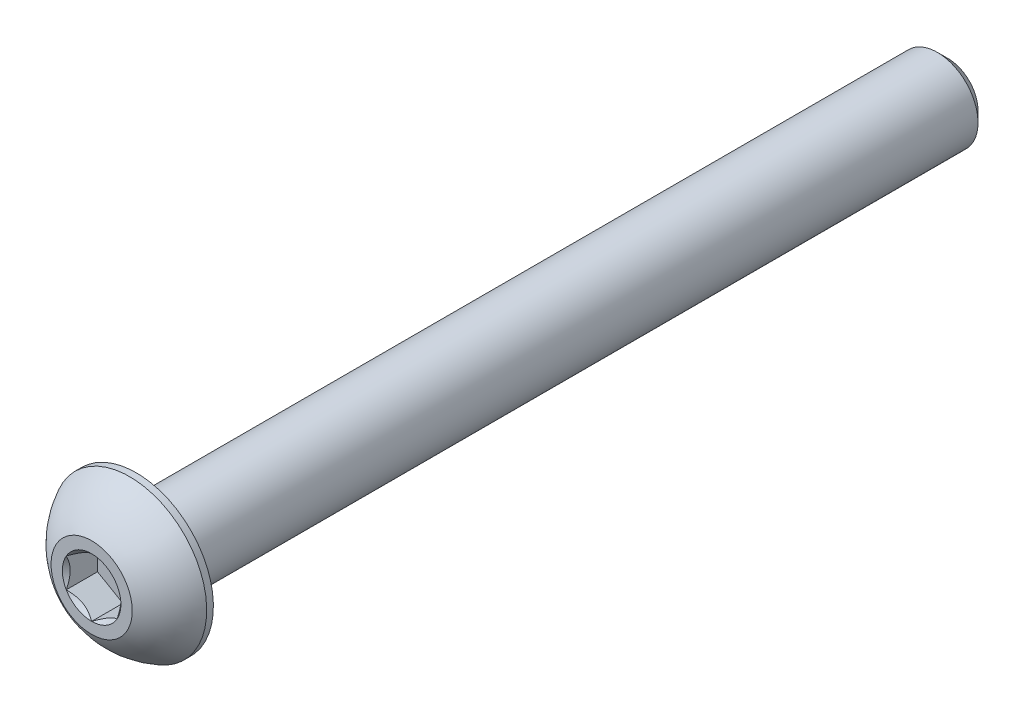
ISO-10303-21;
HEADER;
FILE_DESCRIPTION(('STEP AP214'),'2;1');
FILE_NAME('part.step','',(''),(''),'','','');
FILE_SCHEMA(('AUTOMOTIVE_DESIGN { 1 0 10303 214 1 1 1 1 }'));
ENDSEC;
DATA;
#1=APPLICATION_CONTEXT('core data for automotive mechanical design processes');
#2=APPLICATION_PROTOCOL_DEFINITION('international standard','automotive_design',2000,#1);
#3=PRODUCT_CONTEXT('',#1,'mechanical');
#4=PRODUCT('Part','Part','',(#3));
#5=PRODUCT_RELATED_PRODUCT_CATEGORY('part','',(#4));
#6=PRODUCT_DEFINITION_FORMATION('','',#4);
#7=PRODUCT_DEFINITION_CONTEXT('part definition',#1,'design');
#8=PRODUCT_DEFINITION('design','',#6,#7);
#9=PRODUCT_DEFINITION_SHAPE('','',#8);
#10=(LENGTH_UNIT() NAMED_UNIT(*) SI_UNIT(.MILLI.,.METRE.));
#11=(NAMED_UNIT(*) PLANE_ANGLE_UNIT() SI_UNIT($,.RADIAN.));
#12=(NAMED_UNIT(*) SI_UNIT($,.STERADIAN.) SOLID_ANGLE_UNIT());
#13=UNCERTAINTY_MEASURE_WITH_UNIT(LENGTH_MEASURE(1.E-05),#10,'distance_accuracy_value','');
#14=(GEOMETRIC_REPRESENTATION_CONTEXT(3) GLOBAL_UNCERTAINTY_ASSIGNED_CONTEXT((#13)) GLOBAL_UNIT_ASSIGNED_CONTEXT((#10,
#11,#12)) REPRESENTATION_CONTEXT('',''));
#15=CARTESIAN_POINT('',(0.,0.,0.));
#16=DIRECTION('',(0.,0.,1.));
#17=DIRECTION('',(1.,0.,0.));
#18=AXIS2_PLACEMENT_3D('',#15,#16,#17);
#19=CARTESIAN_POINT('',(0.,0.,-20.));
#20=DIRECTION('',(0.,0.,1.));
#21=DIRECTION('',(0.,-1.,0.));
#22=AXIS2_PLACEMENT_3D('',#19,#20,#21);
#23=PLANE('',#22);
#24=CARTESIAN_POINT('',(0.,0.,-20.));
#25=DIRECTION('',(0.,0.,1.));
#26=DIRECTION('',(0.,-1.,0.));
#27=AXIS2_PLACEMENT_3D('',#24,#25,#26);
#28=CIRCLE('',#27,1.47499999999999);
#29=CARTESIAN_POINT('',(0.,-1.475,-20.));
#30=VERTEX_POINT('',#29);
#31=EDGE_CURVE('E54',#30,#30,#28,.T.);
#32=ORIENTED_EDGE('',*,*,#31,.F.);
#33=EDGE_LOOP('',(#32));
#34=FACE_BOUND('',#33,.T.);
#35=ADVANCED_FACE('F41',(#34),#23,.F.);
#36=CARTESIAN_POINT('',(0.,0.,-20.));
#37=DIRECTION('',(0.,0.,1.));
#38=DIRECTION('',(0.,-1.,0.));
#39=AXIS2_PLACEMENT_3D('',#36,#37,#38);
#40=CONICAL_SURFACE('',#39,1.47499999999999,0.78539816339745);
#41=CARTESIAN_POINT('',(0.,0.,-19.475));
#42=DIRECTION('',(0.,0.,1.));
#43=DIRECTION('',(0.,-1.,0.));
#44=AXIS2_PLACEMENT_3D('',#41,#42,#43);
#45=CIRCLE('',#44,1.99999999999999);
#46=CARTESIAN_POINT('',(0.,-2.,-19.475));
#47=VERTEX_POINT('',#46);
#48=EDGE_CURVE('E185',#47,#47,#45,.T.);
#49=ORIENTED_EDGE('',*,*,#48,.F.);
#50=EDGE_LOOP('',(#49));
#51=FACE_BOUND('',#50,.T.);
#52=ORIENTED_EDGE('',*,*,#31,.T.);
#53=EDGE_LOOP('',(#52));
#54=FACE_BOUND('',#53,.T.);
#55=ADVANCED_FACE('F190',(#51,#54),#40,.T.);
#56=CARTESIAN_POINT('',(0.,0.,22.2));
#57=DIRECTION('',(0.,0.,1.));
#58=DIRECTION('',(0.,-1.,0.));
#59=AXIS2_PLACEMENT_3D('',#56,#57,#58);
#60=CYLINDRICAL_SURFACE('',#59,1.99999999999999);
#61=CARTESIAN_POINT('',(0.,0.,20.));
#62=DIRECTION('',(0.,0.,1.));
#63=DIRECTION('',(0.,-1.,0.));
#64=AXIS2_PLACEMENT_3D('',#61,#62,#63);
#65=CIRCLE('',#64,2.);
#66=CARTESIAN_POINT('',(0.,-2.,20.));
#67=VERTEX_POINT('',#66);
#68=EDGE_CURVE('E182',#67,#67,#65,.T.);
#69=ORIENTED_EDGE('',*,*,#68,.F.);
#70=EDGE_LOOP('',(#69));
#71=FACE_BOUND('',#70,.T.);
#72=ORIENTED_EDGE('',*,*,#48,.T.);
#73=EDGE_LOOP('',(#72));
#74=FACE_BOUND('',#73,.T.);
#75=ADVANCED_FACE('F196',(#71,#74),#60,.T.);
#76=CARTESIAN_POINT('',(0.,-3.79999999999999,20.));
#77=DIRECTION('',(0.,0.,1.));
#78=DIRECTION('',(0.,-1.,0.));
#79=AXIS2_PLACEMENT_3D('',#76,#77,#78);
#80=PLANE('',#79);
#81=CARTESIAN_POINT('',(0.,0.,20.));
#82=DIRECTION('',(0.,0.,1.));
#83=DIRECTION('',(0.,-1.,0.));
#84=AXIS2_PLACEMENT_3D('',#81,#82,#83);
#85=CIRCLE('',#84,3.79999999999998);
#86=CARTESIAN_POINT('',(0.,-3.79999999999999,20.));
#87=VERTEX_POINT('',#86);
#88=EDGE_CURVE('E176',#87,#87,#85,.T.);
#89=ORIENTED_EDGE('',*,*,#88,.F.);
#90=EDGE_LOOP('',(#89));
#91=FACE_BOUND('',#90,.T.);
#92=ORIENTED_EDGE('',*,*,#68,.T.);
#93=EDGE_LOOP('',(#92));
#94=FACE_BOUND('',#93,.T.);
#95=ADVANCED_FACE('F201',(#91,#94),#80,.F.);
#96=CARTESIAN_POINT('',(0.,0.,18.4735561497326));
#97=DIRECTION('',(0.,0.,1.));
#98=DIRECTION('',(0.,-1.,0.));
#99=AXIS2_PLACEMENT_3D('',#96,#97,#98);
#100=SPHERICAL_SURFACE('',#99,4.22922968981297);
#101=CARTESIAN_POINT('',(0.,0.,22.2));
#102=DIRECTION('',(0.,0.,1.));
#103=DIRECTION('',(0.,-1.,0.));
#104=AXIS2_PLACEMENT_3D('',#101,#102,#103);
#105=CIRCLE('',#104,1.99999999999998);
#106=CARTESIAN_POINT('',(0.,-1.99999999999998,22.2));
#107=VERTEX_POINT('',#106);
#108=EDGE_CURVE('E179',#107,#107,#105,.T.);
#109=CARTESIAN_POINT('',(0.,0.,20.33));
#110=DIRECTION('',(0.,0.,1.));
#111=DIRECTION('',(0.,-1.,0.));
#112=AXIS2_PLACEMENT_3D('',#109,#110,#111);
#113=CIRCLE('',#112,3.79999999999998);
#114=CARTESIAN_POINT('',(0.,-3.79999999999999,20.33));
#115=VERTEX_POINT('',#114);
#116=EDGE_CURVE('E173',#115,#115,#113,.T.);
#117=CARTESIAN_POINT('',(0.,-1.99999999999998,22.2));
#118=CARTESIAN_POINT('',(0.,-2.02421343985612,22.1870045740355));
#119=CARTESIAN_POINT('',(0.,-2.04830018323972,22.1737730870349));
#120=CARTESIAN_POINT('',(0.,-2.09621120342124,22.1468431584943));
#121=CARTESIAN_POINT('',(0.,-2.12003548021915,22.1331447169543));
#122=CARTESIAN_POINT('',(0.,-2.16741249358865,22.105286046868));
#123=CARTESIAN_POINT('',(0.,-2.19096523016024,22.0911258183216));
#124=CARTESIAN_POINT('',(0.,-2.23779021933681,22.062348964764));
#125=CARTESIAN_POINT('',(0.,-2.26106247194179,22.0477323397528));
#126=CARTESIAN_POINT('',(0.,-2.3073176488607,22.0180482444859));
#127=CARTESIAN_POINT('',(0.,-2.33030057317463,22.0029807742302));
#128=CARTESIAN_POINT('',(0.,-2.37596836104233,21.9724007144171));
#129=CARTESIAN_POINT('',(0.,-2.3986532245961,21.9568881248597));
#130=CARTESIAN_POINT('',(0.,-2.44371627121512,21.9254237206041));
#131=CARTESIAN_POINT('',(0.,-2.46609445428036,21.9094719059059));
#132=CARTESIAN_POINT('',(0.,-2.5105356368618,21.8771351126683));
#133=CARTESIAN_POINT('',(0.,-2.53259863637799,21.8607501341289));
#134=CARTESIAN_POINT('',(0.,-2.5764010685249,21.8275532390328));
#135=CARTESIAN_POINT('',(0.,-2.59814050115562,21.8107413224761));
#136=CARTESIAN_POINT('',(0.,-2.64128753915152,21.7766969394119));
#137=CARTESIAN_POINT('',(0.,-2.66269514451669,21.7594644729043));
#138=CARTESIAN_POINT('',(0.,-2.70517039368394,21.724585537797));
#139=CARTESIAN_POINT('',(0.,-2.72623803748601,21.7069390691974));
#140=CARTESIAN_POINT('',(0.,-2.76802535840617,21.6712388350756));
#141=CARTESIAN_POINT('',(0.,-2.78874503552426,21.6531850695534));
#142=CARTESIAN_POINT('',(0.,-2.82982855017312,21.6166771015172));
#143=CARTESIAN_POINT('',(0.,-2.85019238770387,21.5982228990032));
#144=CARTESIAN_POINT('',(0.,-2.89055648548393,21.560921069069));
#145=CARTESIAN_POINT('',(0.,-2.91055674573322,21.5420734416488));
#146=CARTESIAN_POINT('',(0.,-2.95018608940551,21.5039919234787));
#147=CARTESIAN_POINT('',(0.,-2.9698151728285,21.4847580327288));
#148=CARTESIAN_POINT('',(0.,-3.00869470434026,21.4459112962447));
#149=CARTESIAN_POINT('',(0.,-3.02794515242902,21.4262984505106));
#150=CARTESIAN_POINT('',(0.,-3.06606009863532,21.3867012563963));
#151=CARTESIAN_POINT('',(0.,-3.08492459675285,21.3667169080161));
#152=CARTESIAN_POINT('',(0.,-3.12226047503001,21.3263843021083));
#153=CARTESIAN_POINT('',(0.,-3.14073185518963,21.3060360445808));
#154=CARTESIAN_POINT('',(0.,-3.1772744789382,21.2649833521526));
#155=CARTESIAN_POINT('',(0.,-3.19534572252714,21.2442789172519));
#156=CARTESIAN_POINT('',(0.,-3.23108120656241,21.202521737189));
#157=CARTESIAN_POINT('',(0.,-3.24874544700873,21.1814689920269));
#158=CARTESIAN_POINT('',(0.,-3.28366021283672,21.139023190901));
#159=CARTESIAN_POINT('',(0.,-3.30091073821837,21.1176301349374));
#160=CARTESIAN_POINT('',(0.,-3.33499151919533,21.0745118409772));
#161=CARTESIAN_POINT('',(0.,-3.35182177479062,21.0527866029806));
#162=CARTESIAN_POINT('',(0.,-3.3850556211637,21.0090121999432));
#163=CARTESIAN_POINT('',(0.,-3.40145921194148,20.9869630349023));
#164=CARTESIAN_POINT('',(0.,-3.43383349577045,20.9425491558485));
#165=CARTESIAN_POINT('',(0.,-3.44980418882165,20.9201844418356));
#166=CARTESIAN_POINT('',(0.,-3.48130660877274,20.8751479628077));
#167=CARTESIAN_POINT('',(0.,-3.49683833567262,20.8524761977926));
#168=CARTESIAN_POINT('',(0.,-3.5274569217093,20.8068342314103));
#169=CARTESIAN_POINT('',(0.,-3.54254378084609,20.7838640300431));
#170=CARTESIAN_POINT('',(0.,-3.57226689871517,20.7376339189694));
#171=CARTESIAN_POINT('',(0.,-3.58690315744746,20.7143740092629));
#172=CARTESIAN_POINT('',(0.,-3.61571951333198,20.6675733197334));
#173=CARTESIAN_POINT('',(0.,-3.62989961048421,20.6440325399103));
#174=CARTESIAN_POINT('',(0.,-3.65779825442822,20.5966790546141));
#175=CARTESIAN_POINT('',(0.,-3.67151680122001,20.5728663491409));
#176=CARTESIAN_POINT('',(0.,-3.6984871345232,20.5249780621223));
#177=CARTESIAN_POINT('',(0.,-3.7117389210346,20.5009024805769));
#178=CARTESIAN_POINT('',(0.,-3.73777068821036,20.4524975842079));
#179=CARTESIAN_POINT('',(0.,-3.75055066887473,20.4281682693842));
#180=CARTESIAN_POINT('',(0.,-3.77563400658952,20.3792651705548));
#181=CARTESIAN_POINT('',(0.,-3.78793736363996,20.354691386549));
#182=CARTESIAN_POINT('',(0.,-3.79999999999999,20.33));
#183=B_SPLINE_CURVE_WITH_KNOTS('',3,(#117,#118,#119,#120,#121,#122,#123,#124,#125,#126,#127,
#128,#129,#130,#131,#132,#133,#134,#135,#136,#137,#138,#139,#140,#141,#142,#143,#144,#145,#146,
#147,#148,#149,#150,#151,#152,#153,#154,#155,#156,#157,#158,#159,#160,#161,#162,#163,#164,#165,
#166,#167,#168,#169,#170,#171,#172,#173,#174,#175,#176,#177,#178,#179,#180,#181,#182),
.UNSPECIFIED.,.F.,.F.,(4,2,2,2,2,2,2,2,2,2,2,2,2,2,2,2,2,2,2,2,2,2,2,2,2,2,2,2,2,2,2,2,4),(0.,
0.0824398589102658,0.16487971782053,0.247319576730794,0.329759435641059,0.412199294551324,
0.494639153461589,0.577079012371853,0.659518871282118,0.741958730192381,0.824398589102647,
0.906838448012911,0.989278306923176,1.07171816583344,1.1541580247437,1.23659788365397,
1.31903774256424,1.4014776014745,1.48391746038476,1.56635731929503,1.64879717820529,
1.73123703711556,1.81367689602582,1.89611675493609,1.97855661384635,2.06099647275661,
2.14343633166688,2.22587619057714,2.30831604948741,2.39075590839767,2.47319576730794,
2.5556356262182,2.63807548512846),.UNSPECIFIED.);
#184=EDGE_CURVE('BSEAM206',#107,#115,#183,.T.);
#185=ORIENTED_EDGE('',*,*,#108,.F.);
#186=ORIENTED_EDGE('',*,*,#116,.T.);
#187=ORIENTED_EDGE('',*,*,#184,.T.);
#188=ORIENTED_EDGE('',*,*,#184,.F.);
#189=EDGE_LOOP('',(#185,#187,#186,#188));
#190=FACE_BOUND('',#189,.T.);
#191=ADVANCED_FACE('F206',(#190),#100,.T.);
#192=CARTESIAN_POINT('',(0.,-1.99999999999999,22.2));
#193=DIRECTION('',(0.,0.,-1.));
#194=DIRECTION('',(0.,1.,0.));
#195=AXIS2_PLACEMENT_3D('',#192,#193,#194);
#196=PLANE('',#195);
#197=CARTESIAN_POINT('',(0.,0.,22.2));
#198=DIRECTION('',(0.,0.,1.));
#199=DIRECTION('',(1.,0.,0.));
#200=AXIS2_PLACEMENT_3D('',#197,#198,#199);
#201=CIRCLE('',#200,1.44337567297405);
#202=CARTESIAN_POINT('',(0.,1.44337567297405,22.2));
#203=VERTEX_POINT('',#202);
#204=CARTESIAN_POINT('',(-1.24999999999998,0.721687836487032,22.2));
#205=VERTEX_POINT('',#204);
#206=EDGE_CURVE('E140',#203,#205,#201,.T.);
#207=ORIENTED_EDGE('',*,*,#206,.F.);
#208=CARTESIAN_POINT('',(1.24999999999999,0.721687836487025,22.2));
#209=VERTEX_POINT('',#208);
#210=EDGE_CURVE('E137',#209,#203,#201,.T.);
#211=ORIENTED_EDGE('',*,*,#210,.F.);
#212=CARTESIAN_POINT('',(1.24999999999999,-0.721687836487023,22.2));
#213=VERTEX_POINT('',#212);
#214=EDGE_CURVE('E107',#213,#209,#201,.T.);
#215=ORIENTED_EDGE('',*,*,#214,.F.);
#216=CARTESIAN_POINT('',(0.,-1.44337567297405,22.2));
#217=VERTEX_POINT('',#216);
#218=EDGE_CURVE('E99',#217,#213,#201,.T.);
#219=ORIENTED_EDGE('',*,*,#218,.F.);
#220=CARTESIAN_POINT('',(-1.24999999999999,-0.721687836487023,22.2));
#221=VERTEX_POINT('',#220);
#222=EDGE_CURVE('E60',#221,#217,#201,.T.);
#223=ORIENTED_EDGE('',*,*,#222,.F.);
#224=EDGE_CURVE('E67',#205,#221,#201,.T.);
#225=ORIENTED_EDGE('',*,*,#224,.F.);
#226=EDGE_LOOP('',(#207,#211,#215,#219,#223,#225));
#227=FACE_BOUND('',#226,.T.);
#228=ORIENTED_EDGE('',*,*,#108,.T.);
#229=EDGE_LOOP('',(#228));
#230=FACE_BOUND('',#229,.T.);
#231=ADVANCED_FACE('F134',(#227,#230),#196,.F.);
#232=CARTESIAN_POINT('',(0.,0.,22.2));
#233=DIRECTION('',(0.,0.,1.));
#234=DIRECTION('',(0.,-1.,0.));
#235=AXIS2_PLACEMENT_3D('',#232,#233,#234);
#236=CYLINDRICAL_SURFACE('',#235,3.79999999999998);
#237=ORIENTED_EDGE('',*,*,#116,.F.);
#238=EDGE_LOOP('',(#237));
#239=FACE_BOUND('',#238,.T.);
#240=ORIENTED_EDGE('',*,*,#88,.T.);
#241=EDGE_LOOP('',(#240));
#242=FACE_BOUND('',#241,.T.);
#243=ADVANCED_FACE('F212',(#239,#242),#236,.T.);
#244=CARTESIAN_POINT('',(0.,0.,22.2));
#245=DIRECTION('',(0.,0.,1.));
#246=DIRECTION('',(1.,0.,0.));
#247=AXIS2_PLACEMENT_3D('',#244,#245,#246);
#248=CONICAL_SURFACE('',#247,1.44337567297405,0.78539816339745);
#249=ORIENTED_EDGE('',*,*,#214,.T.);
#250=CARTESIAN_POINT('',(1.24999999999999,-1.43934010808074,22.6629820968923));
#251=CARTESIAN_POINT('',(1.24999999999999,-1.40429313005656,22.6365249226329));
#252=CARTESIAN_POINT('',(1.24999999999999,-1.36905087135596,22.6103271603543));
#253=CARTESIAN_POINT('',(1.24999999999999,-1.29809650706308,22.5585575718396));
#254=CARTESIAN_POINT('',(1.24999999999999,-1.26238428576493,22.5329859043563));
#255=CARTESIAN_POINT('',(1.24999999999999,-1.15390111792706,22.4570059936895));
#256=CARTESIAN_POINT('',(1.24999999999999,-1.08031646726262,22.4077402861896));
#257=CARTESIAN_POINT('',(1.24999999999999,-0.926012322755077,22.3110258302631));
#258=CARTESIAN_POINT('',(1.24999999999999,-0.845125318656129,22.2638412989418));
#259=CARTESIAN_POINT('',(1.24999999999999,-0.679311174076587,22.1775307343904));
#260=CARTESIAN_POINT('',(1.24999999999999,-0.594398891026675,22.1383775346269));
#261=CARTESIAN_POINT('',(1.24999999999999,-0.46694481246073,22.0904772236883));
#262=CARTESIAN_POINT('',(1.24999999999999,-0.426289985812812,22.0767294897863));
#263=CARTESIAN_POINT('',(1.24999999999999,-0.343998850091259,22.0524979274505));
#264=CARTESIAN_POINT('',(1.24999999999999,-0.302362473614955,22.0420143238698));
#265=CARTESIAN_POINT('',(1.24999999999999,-0.21905269628566,22.0250301617483));
#266=CARTESIAN_POINT('',(1.24999999999999,-0.177393428474494,22.0184613604714));
#267=CARTESIAN_POINT('',(1.24999999999999,-0.0936293693401875,22.0094350534578));
#268=CARTESIAN_POINT('',(1.24999999999999,-0.0515246558543921,22.0069768409973));
#269=CARTESIAN_POINT('',(1.24999999999999,0.0311890576306343,22.0063540620133));
#270=CARTESIAN_POINT('',(1.24999999999999,0.0717969625499326,22.0080371168462));
#271=CARTESIAN_POINT('',(1.24999999999999,0.152668636885198,22.0152682705979));
#272=CARTESIAN_POINT('',(1.24999999999999,0.192932338835358,22.0208171104131));
#273=CARTESIAN_POINT('',(1.24999999999999,0.273499879165294,22.035571036465));
#274=CARTESIAN_POINT('',(1.24999999999999,0.313792180618509,22.0448381759641));
#275=CARTESIAN_POINT('',(1.24999999999999,0.393496413911454,22.0665361784573));
#276=CARTESIAN_POINT('',(1.24999999999999,0.432908419115056,22.0789667767306));
#277=CARTESIAN_POINT('',(1.24999999999999,0.556992735862294,22.1227793529314));
#278=CARTESIAN_POINT('',(1.24999999999999,0.63989892466608,22.159151072876));
#279=CARTESIAN_POINT('',(1.24999999999999,0.801816555499694,22.2400191621783));
#280=CARTESIAN_POINT('',(1.24999999999999,0.880812666325036,22.284544720912));
#281=CARTESIAN_POINT('',(1.24999999999999,1.03178561279749,22.3764048766666));
#282=CARTESIAN_POINT('',(1.24999999999999,1.10391618485085,22.4234899339162));
#283=CARTESIAN_POINT('',(1.24999999999999,1.21018606043309,22.4962785615985));
#284=CARTESIAN_POINT('',(1.24999999999999,1.24515069969378,22.5207980853934));
#285=CARTESIAN_POINT('',(1.24999999999999,1.31460220852735,22.5704856367657));
#286=CARTESIAN_POINT('',(1.24999999999999,1.34908920596617,22.5956534854155));
#287=CARTESIAN_POINT('',(1.24999999999999,1.3833773168291,22.6210901488412));
#288=B_SPLINE_CURVE_WITH_KNOTS('',3,(#250,#251,#252,#253,#254,#255,#256,#257,#258,#259,#260,
#261,#262,#263,#264,#265,#266,#267,#268,#269,#270,#271,#272,#273,#274,#275,#276,#277,#278,#279,
#280,#281,#282,#283,#284,#285,#286,#287),.UNSPECIFIED.,.F.,.F.,(4,2,2,2,2,2,2,2,2,2,2,2,2,2,2,2,
2,2,4),(0.,0.131732960381446,0.263498984161638,0.529042014455815,0.809741926134604,
1.08947609717223,1.21811634272574,1.34676544783898,1.47310084517841,1.59941451973782,
1.72115042167846,1.84290966131732,1.96679153905338,2.09066305366036,2.36146692896005,
2.63325989198487,2.89154668212275,3.01965734507708,3.14773302245623),.UNSPECIFIED.);
#289=EDGE_CURVE('E11',#213,#209,#288,.T.);
#290=ORIENTED_EDGE('',*,*,#289,.F.);
#291=EDGE_LOOP('',(#249,#290));
#292=FACE_BOUND('',#291,.T.);
#293=ADVANCED_FACE('F111',(#292),#248,.F.);
#294=ORIENTED_EDGE('',*,*,#210,.T.);
#295=CARTESIAN_POINT('',(1.25019999999999,0.721572366433192,22.2001154839091));
#296=CARTESIAN_POINT('',(1.2072248329284,0.746384090710442,22.1753216680551));
#297=CARTESIAN_POINT('',(1.16353099525404,0.771610739653662,22.1519837344187));
#298=CARTESIAN_POINT('',(1.07443406915805,0.823050873919151,22.1092520040845));
#299=CARTESIAN_POINT('',(1.02902250164293,0.849269254648329,22.0898819923604));
#300=CARTESIAN_POINT('',(0.93745217906473,0.902137405038631,22.0567004834135));
#301=CARTESIAN_POINT('',(0.891316759824104,0.928773701756383,22.0428055590527));
#302=CARTESIAN_POINT('',(0.798029919592398,0.982632884076008,22.0213972821606));
#303=CARTESIAN_POINT('',(0.750881350863611,1.00985412292348,22.0138679415668));
#304=CARTESIAN_POINT('',(0.66962644311274,1.05676666578642,22.0070744980507));
#305=CARTESIAN_POINT('',(0.635625123372051,1.07639733689151,22.0060685591044));
#306=CARTESIAN_POINT('',(0.567682235567516,1.11562418145498,22.0077614149113));
#307=CARTESIAN_POINT('',(0.533740682344336,1.1352203463451,22.0104610272155));
#308=CARTESIAN_POINT('',(0.466185143542494,1.17422355485759,22.0194089303164));
#309=CARTESIAN_POINT('',(0.432571492713219,1.19363040521232,22.0256605258997));
#310=CARTESIAN_POINT('',(0.365905361782181,1.23212011385118,22.0413756814139));
#311=CARTESIAN_POINT('',(0.332853128969699,1.25120282936279,22.0508406200875));
#312=CARTESIAN_POINT('',(0.248200308399731,1.30007715810652,22.0789313906876));
#313=CARTESIAN_POINT('',(0.197133507570359,1.32956058931201,22.0996701574522));
#314=CARTESIAN_POINT('',(0.0969991458867443,1.38737318998518,22.1463871346715));
#315=CARTESIAN_POINT('',(0.0479256884217308,1.41570576386267,22.1723482959468));
#316=CARTESIAN_POINT('',(-0.000199999999999486,1.44349114302789,22.2001154839091));
#317=B_SPLINE_CURVE_WITH_KNOTS('',3,(#295,#296,#297,#298,#299,#300,#301,#302,#303,#304,#305,
#306,#307,#308,#309,#310,#311,#312,#313,#314,#315,#316),.UNSPECIFIED.,.F.,.F.,(4,2,2,2,2,2,2,2,
2,2,4),(0.,0.1665334096183,0.334037607289757,0.498880396489692,0.663307919240266,
0.780963963458817,0.898645970148443,1.01643764860772,1.13427993171548,1.32148652032139,
1.50809158792572),.UNSPECIFIED.);
#318=EDGE_CURVE('E139',#209,#203,#317,.T.);
#319=ORIENTED_EDGE('',*,*,#318,.F.);
#320=EDGE_LOOP('',(#294,#319));
#321=FACE_BOUND('',#320,.T.);
#322=ADVANCED_FACE('F291',(#321),#248,.F.);
#323=ORIENTED_EDGE('',*,*,#206,.T.);
#324=CARTESIAN_POINT('',(0.000199999999999969,1.44349114302789,22.2001154839091));
#325=CARTESIAN_POINT('',(-0.0427751670715862,1.41867941875064,22.1753216680551));
#326=CARTESIAN_POINT('',(-0.0864690047459474,1.39345276980742,22.1519837344187));
#327=CARTESIAN_POINT('',(-0.175565930841941,1.34201263554193,22.1092520040845));
#328=CARTESIAN_POINT('',(-0.220977498357063,1.31579425481275,22.0898819923604));
#329=CARTESIAN_POINT('',(-0.312547820935258,1.26292610442245,22.0567004834135));
#330=CARTESIAN_POINT('',(-0.358683240175883,1.2362898077047,22.0428055590527));
#331=CARTESIAN_POINT('',(-0.451970080407589,1.18243062538508,22.0213972821606));
#332=CARTESIAN_POINT('',(-0.499118649136376,1.1552093865376,22.0138679415668));
#333=CARTESIAN_POINT('',(-0.580373556887248,1.10829684367466,22.0070744980507));
#334=CARTESIAN_POINT('',(-0.614374876627937,1.08866617256957,22.0060685591044));
#335=CARTESIAN_POINT('',(-0.682317764432472,1.0494393280061,22.0077614149113));
#336=CARTESIAN_POINT('',(-0.716259317655652,1.02984316311599,22.0104610272155));
#337=CARTESIAN_POINT('',(-0.783814856457494,0.990839954603492,22.0194089303164));
#338=CARTESIAN_POINT('',(-0.817428507286769,0.971433104248764,22.0256605258997));
#339=CARTESIAN_POINT('',(-0.884094638217806,0.932943395609899,22.0413756814139));
#340=CARTESIAN_POINT('',(-0.917146871030289,0.913860680098294,22.0508406200875));
#341=CARTESIAN_POINT('',(-1.00179969160026,0.864986351354562,22.0789313906876));
#342=CARTESIAN_POINT('',(-1.05286649242963,0.83550292014907,22.0996701574522));
#343=CARTESIAN_POINT('',(-1.15300085411324,0.777690319475905,22.1463871346715));
#344=CARTESIAN_POINT('',(-1.20207431157826,0.749357745598414,22.1723482959468));
#345=CARTESIAN_POINT('',(-1.25019999999999,0.721572366433192,22.2001154839091));
#346=B_SPLINE_CURVE_WITH_KNOTS('',3,(#324,#325,#326,#327,#328,#329,#330,#331,#332,#333,#334,
#335,#336,#337,#338,#339,#340,#341,#342,#343,#344,#345),.UNSPECIFIED.,.F.,.F.,(4,2,2,2,2,2,2,2,
2,2,4),(0.,0.166533409618303,0.334037607289759,0.498880396489694,0.66330791924027,
0.780963963458821,0.898645970148446,1.01643764860773,1.13427993171549,1.3214865203214,
1.50809158792572),.UNSPECIFIED.);
#347=EDGE_CURVE('E143',#203,#205,#346,.T.);
#348=ORIENTED_EDGE('',*,*,#347,.F.);
#349=EDGE_LOOP('',(#323,#348));
#350=FACE_BOUND('',#349,.T.);
#351=ADVANCED_FACE('F146',(#350),#248,.F.);
#352=ORIENTED_EDGE('',*,*,#224,.T.);
#353=CARTESIAN_POINT('',(-1.24999999999999,-1.43934010808074,22.6629820968923));
#354=CARTESIAN_POINT('',(-1.24999999999999,-1.40429313005656,22.6365249226329));
#355=CARTESIAN_POINT('',(-1.24999999999999,-1.36905087135597,22.6103271603543));
#356=CARTESIAN_POINT('',(-1.24999999999999,-1.29809650706308,22.5585575718396));
#357=CARTESIAN_POINT('',(-1.24999999999999,-1.26238428576493,22.5329859043563));
#358=CARTESIAN_POINT('',(-1.24999999999999,-1.15390111792706,22.4570059936895));
#359=CARTESIAN_POINT('',(-1.24999999999999,-1.08031646726262,22.4077402861896));
#360=CARTESIAN_POINT('',(-1.24999999999999,-0.926012322755076,22.3110258302631));
#361=CARTESIAN_POINT('',(-1.24999999999999,-0.845125318656129,22.2638412989418));
#362=CARTESIAN_POINT('',(-1.24999999999999,-0.679311174076589,22.1775307343904));
#363=CARTESIAN_POINT('',(-1.24999999999999,-0.594398891026676,22.1383775346269));
#364=CARTESIAN_POINT('',(-1.24999999999999,-0.466944812460731,22.0904772236883));
#365=CARTESIAN_POINT('',(-1.24999999999999,-0.426289985812813,22.0767294897863));
#366=CARTESIAN_POINT('',(-1.24999999999999,-0.34399885009126,22.0524979274505));
#367=CARTESIAN_POINT('',(-1.24999999999999,-0.302362473614956,22.0420143238698));
#368=CARTESIAN_POINT('',(-1.24999999999999,-0.21905269628566,22.0250301617483));
#369=CARTESIAN_POINT('',(-1.24999999999999,-0.177393428474495,22.0184613604714));
#370=CARTESIAN_POINT('',(-1.24999999999999,-0.0936293693401882,22.0094350534578));
#371=CARTESIAN_POINT('',(-1.24999999999999,-0.0515246558543926,22.0069768409973));
#372=CARTESIAN_POINT('',(-1.24999999999999,0.0311890576306338,22.0063540620133));
#373=CARTESIAN_POINT('',(-1.24999999999999,0.0717969625499321,22.0080371168462));
#374=CARTESIAN_POINT('',(-1.24999999999999,0.152668636885198,22.0152682705979));
#375=CARTESIAN_POINT('',(-1.24999999999999,0.192932338835358,22.0208171104131));
#376=CARTESIAN_POINT('',(-1.24999999999999,0.273499879165294,22.035571036465));
#377=CARTESIAN_POINT('',(-1.24999999999999,0.313792180618509,22.0448381759641));
#378=CARTESIAN_POINT('',(-1.24999999999999,0.393496413911454,22.0665361784573));
#379=CARTESIAN_POINT('',(-1.24999999999999,0.432908419115056,22.0789667767306));
#380=CARTESIAN_POINT('',(-1.24999999999999,0.556992735862295,22.1227793529314));
#381=CARTESIAN_POINT('',(-1.24999999999999,0.639898924666083,22.159151072876));
#382=CARTESIAN_POINT('',(-1.24999999999999,0.801816555499696,22.2400191621783));
#383=CARTESIAN_POINT('',(-1.24999999999999,0.880812666325037,22.284544720912));
#384=CARTESIAN_POINT('',(-1.24999999999999,1.03178561279749,22.3764048766666));
#385=CARTESIAN_POINT('',(-1.24999999999999,1.10391618485085,22.4234899339162));
#386=CARTESIAN_POINT('',(-1.24999999999999,1.21018606043309,22.4962785615985));
#387=CARTESIAN_POINT('',(-1.24999999999999,1.24515069969378,22.5207980853934));
#388=CARTESIAN_POINT('',(-1.24999999999999,1.31460220852735,22.5704856367657));
#389=CARTESIAN_POINT('',(-1.24999999999999,1.34908920596617,22.5956534854155));
#390=CARTESIAN_POINT('',(-1.24999999999999,1.3833773168291,22.6210901488412));
#391=B_SPLINE_CURVE_WITH_KNOTS('',3,(#353,#354,#355,#356,#357,#358,#359,#360,#361,#362,#363,
#364,#365,#366,#367,#368,#369,#370,#371,#372,#373,#374,#375,#376,#377,#378,#379,#380,#381,#382,
#383,#384,#385,#386,#387,#388,#389,#390),.UNSPECIFIED.,.F.,.F.,(4,2,2,2,2,2,2,2,2,2,2,2,2,2,2,2,
2,2,4),(0.,0.131732960381446,0.263498984161639,0.529042014455817,0.809741926134604,
1.08947609717223,1.21811634272574,1.34676544783898,1.47310084517841,1.59941451973782,
1.72115042167846,1.84290966131732,1.96679153905338,2.09066305366036,2.36146692896006,
2.63325989198487,2.89154668212275,3.01965734507708,3.14773302245624),.UNSPECIFIED.);
#392=EDGE_CURVE('E149',#205,#221,#391,.F.);
#393=ORIENTED_EDGE('',*,*,#392,.F.);
#394=EDGE_LOOP('',(#352,#393));
#395=FACE_BOUND('',#394,.T.);
#396=ADVANCED_FACE('F150',(#395),#248,.F.);
#397=ORIENTED_EDGE('',*,*,#222,.T.);
#398=CARTESIAN_POINT('',(-1.25019999999999,-0.721572366433181,22.2001154839091));
#399=CARTESIAN_POINT('',(-1.2072248329284,-0.74638409071043,22.1753216680551));
#400=CARTESIAN_POINT('',(-1.16353099525404,-0.77161073965365,22.1519837344187));
#401=CARTESIAN_POINT('',(-1.07443406915805,-0.82305087391914,22.1092520040845));
#402=CARTESIAN_POINT('',(-1.02902250164292,-0.849269254648318,22.0898819923604));
#403=CARTESIAN_POINT('',(-0.937452179064729,-0.90213740503862,22.0567004834135));
#404=CARTESIAN_POINT('',(-0.891316759824104,-0.928773701756372,22.0428055590527));
#405=CARTESIAN_POINT('',(-0.798029919592398,-0.982632884075997,22.0213972821606));
#406=CARTESIAN_POINT('',(-0.750881350863611,-1.00985412292347,22.0138679415668));
#407=CARTESIAN_POINT('',(-0.669626443112739,-1.05676666578641,22.0070744980507));
#408=CARTESIAN_POINT('',(-0.635625123372051,-1.0763973368915,22.0060685591043));
#409=CARTESIAN_POINT('',(-0.567682235567516,-1.11562418145497,22.0077614149113));
#410=CARTESIAN_POINT('',(-0.533740682344336,-1.13522034634509,22.0104610272155));
#411=CARTESIAN_POINT('',(-0.466185143542495,-1.17422355485758,22.0194089303164));
#412=CARTESIAN_POINT('',(-0.43257149271322,-1.19363040521231,22.0256605258997));
#413=CARTESIAN_POINT('',(-0.365905361782183,-1.23212011385117,22.0413756814139));
#414=CARTESIAN_POINT('',(-0.332853128969701,-1.25120282936278,22.0508406200875));
#415=CARTESIAN_POINT('',(-0.248200308399733,-1.30007715810651,22.0789313906876));
#416=CARTESIAN_POINT('',(-0.19713350757036,-1.329560589312,22.0996701574522));
#417=CARTESIAN_POINT('',(-0.0969991458867443,-1.38737318998517,22.1463871346715));
#418=CARTESIAN_POINT('',(-0.04792568842173,-1.41570576386266,22.1723482959468));
#419=CARTESIAN_POINT('',(0.000199999999999851,-1.44349114302788,22.2001154839091));
#420=B_SPLINE_CURVE_WITH_KNOTS('',3,(#398,#399,#400,#401,#402,#403,#404,#405,#406,#407,#408,
#409,#410,#411,#412,#413,#414,#415,#416,#417,#418,#419),.UNSPECIFIED.,.F.,.F.,(4,2,2,2,2,2,2,2,
2,2,4),(0.,0.166533409618303,0.334037607289758,0.498880396489694,0.663307919240268,
0.780963963458819,0.898645970148443,1.01643764860772,1.13427993171548,1.32148652032139,
1.50809158792572),.UNSPECIFIED.);
#421=EDGE_CURVE('E123',#221,#217,#420,.T.);
#422=ORIENTED_EDGE('',*,*,#421,.F.);
#423=EDGE_LOOP('',(#397,#422));
#424=FACE_BOUND('',#423,.T.);
#425=ADVANCED_FACE('F240',(#424),#248,.F.);
#426=ORIENTED_EDGE('',*,*,#218,.T.);
#427=CARTESIAN_POINT('',(-0.000199999999999352,-1.44349114302788,22.2001154839091));
#428=CARTESIAN_POINT('',(0.0427751670715873,-1.41867941875063,22.1753216680551));
#429=CARTESIAN_POINT('',(0.0864690047459479,-1.39345276980741,22.1519837344187));
#430=CARTESIAN_POINT('',(0.175565930841941,-1.34201263554192,22.1092520040845));
#431=CARTESIAN_POINT('',(0.220977498357062,-1.31579425481274,22.0898819923604));
#432=CARTESIAN_POINT('',(0.312547820935257,-1.26292610442244,22.0567004834135));
#433=CARTESIAN_POINT('',(0.358683240175882,-1.23628980770469,22.0428055590527));
#434=CARTESIAN_POINT('',(0.451970080407588,-1.18243062538506,22.0213972821606));
#435=CARTESIAN_POINT('',(0.499118649136375,-1.15520938653759,22.0138679415668));
#436=CARTESIAN_POINT('',(0.580373556887246,-1.10829684367465,22.0070744980507));
#437=CARTESIAN_POINT('',(0.614374876627934,-1.08866617256956,22.0060685591043));
#438=CARTESIAN_POINT('',(0.68231776443247,-1.04943932800609,22.0077614149113));
#439=CARTESIAN_POINT('',(0.716259317655649,-1.02984316311598,22.0104610272155));
#440=CARTESIAN_POINT('',(0.78381485645749,-0.990839954603482,22.0194089303164));
#441=CARTESIAN_POINT('',(0.817428507286765,-0.971433104248755,22.0256605258997));
#442=CARTESIAN_POINT('',(0.884094638217802,-0.932943395609889,22.0413756814139));
#443=CARTESIAN_POINT('',(0.917146871030285,-0.913860680098284,22.0508406200875));
#444=CARTESIAN_POINT('',(1.00179969160025,-0.864986351354552,22.0789313906876));
#445=CARTESIAN_POINT('',(1.05286649242963,-0.83550292014906,22.0996701574522));
#446=CARTESIAN_POINT('',(1.15300085411324,-0.777690319475893,22.1463871346715));
#447=CARTESIAN_POINT('',(1.20207431157826,-0.749357745598402,22.1723482959468));
#448=CARTESIAN_POINT('',(1.25019999999999,-0.72157236643318,22.2001154839091));
#449=B_SPLINE_CURVE_WITH_KNOTS('',3,(#427,#428,#429,#430,#431,#432,#433,#434,#435,#436,#437,
#438,#439,#440,#441,#442,#443,#444,#445,#446,#447,#448),.UNSPECIFIED.,.F.,.F.,(4,2,2,2,2,2,2,2,
2,2,4),(0.,0.1665334096183,0.334037607289759,0.498880396489691,0.663307919240267,
0.780963963458817,0.898645970148441,1.01643764860772,1.13427993171548,1.32148652032139,
1.50809158792572),.UNSPECIFIED.);
#450=EDGE_CURVE('E103',#217,#213,#449,.T.);
#451=ORIENTED_EDGE('',*,*,#450,.F.);
#452=EDGE_LOOP('',(#426,#451));
#453=FACE_BOUND('',#452,.T.);
#454=ADVANCED_FACE('F101',(#453),#248,.F.);
#455=CARTESIAN_POINT('',(1.24999999999999,-0.721687836487018,20.66));
#456=DIRECTION('',(0.,0.,1.));
#457=DIRECTION('',(1.,0.,0.));
#458=AXIS2_PLACEMENT_3D('',#455,#456,#457);
#459=PLANE('',#458);
#460=DIRECTION('',(0.866025403784438,0.5,0.));
#461=VECTOR('',#460,1.);
#462=CARTESIAN_POINT('',(0.,-1.44337567297404,20.66));
#463=LINE('',#462,#461);
#464=CARTESIAN_POINT('',(0.,-1.44337567297404,20.66));
#465=VERTEX_POINT('',#464);
#466=CARTESIAN_POINT('',(1.24999999999999,-0.721687836487018,20.66));
#467=VERTEX_POINT('',#466);
#468=EDGE_CURVE('E122',#465,#467,#463,.T.);
#469=ORIENTED_EDGE('',*,*,#468,.T.);
#470=DIRECTION('',(0.,1.,0.));
#471=VECTOR('',#470,1.);
#472=CARTESIAN_POINT('',(1.24999999999999,-0.721687836487018,20.66));
#473=LINE('',#472,#471);
#474=CARTESIAN_POINT('',(1.24999999999999,0.72168783648703,20.66));
#475=VERTEX_POINT('',#474);
#476=EDGE_CURVE('E127',#467,#475,#473,.T.);
#477=ORIENTED_EDGE('',*,*,#476,.T.);
#478=DIRECTION('',(-0.866025403784439,0.5,0.));
#479=VECTOR('',#478,1.);
#480=CARTESIAN_POINT('',(1.24999999999999,0.72168783648703,20.66));
#481=LINE('',#480,#479);
#482=CARTESIAN_POINT('',(0.,1.44337567297405,20.66));
#483=VERTEX_POINT('',#482);
#484=EDGE_CURVE('E274',#475,#483,#481,.T.);
#485=ORIENTED_EDGE('',*,*,#484,.T.);
#486=DIRECTION('',(-0.866025403784439,-0.5,0.));
#487=VECTOR('',#486,1.);
#488=CARTESIAN_POINT('',(0.,1.44337567297405,20.66));
#489=LINE('',#488,#487);
#490=CARTESIAN_POINT('',(-1.24999999999999,0.72168783648703,20.66));
#491=VERTEX_POINT('',#490);
#492=EDGE_CURVE('E276',#483,#491,#489,.T.);
#493=ORIENTED_EDGE('',*,*,#492,.T.);
#494=DIRECTION('',(0.,-1.,0.));
#495=VECTOR('',#494,1.);
#496=CARTESIAN_POINT('',(-1.24999999999999,0.72168783648703,20.66));
#497=LINE('',#496,#495);
#498=CARTESIAN_POINT('',(-1.24999999999999,-0.721687836487019,20.66));
#499=VERTEX_POINT('',#498);
#500=EDGE_CURVE('E164',#491,#499,#497,.T.);
#501=ORIENTED_EDGE('',*,*,#500,.T.);
#502=DIRECTION('',(0.866025403784438,-0.5,0.));
#503=VECTOR('',#502,1.);
#504=CARTESIAN_POINT('',(-1.24999999999999,-0.721687836487019,20.66));
#505=LINE('',#504,#503);
#506=EDGE_CURVE('E130',#499,#465,#505,.T.);
#507=ORIENTED_EDGE('',*,*,#506,.T.);
#508=EDGE_LOOP('',(#469,#477,#485,#493,#501,#507));
#509=FACE_BOUND('',#508,.T.);
#510=ADVANCED_FACE('F239',(#509),#459,.T.);
#511=CARTESIAN_POINT('',(1.24999999999999,-0.721687836487018,20.66));
#512=DIRECTION('',(1.,0.,0.));
#513=DIRECTION('',(0.,0.,-1.));
#514=AXIS2_PLACEMENT_3D('',#511,#512,#513);
#515=PLANE('',#514);
#516=DIRECTION('',(0.,0.,1.));
#517=VECTOR('',#516,1.);
#518=CARTESIAN_POINT('',(1.24999999999999,-0.721687836487018,20.66));
#519=LINE('',#518,#517);
#520=EDGE_CURVE('E119',#467,#213,#519,.T.);
#521=ORIENTED_EDGE('',*,*,#520,.T.);
#522=ORIENTED_EDGE('',*,*,#289,.T.);
#523=DIRECTION('',(0.,0.,1.));
#524=VECTOR('',#523,1.);
#525=CARTESIAN_POINT('',(1.24999999999999,0.72168783648703,20.66));
#526=LINE('',#525,#524);
#527=EDGE_CURVE('E129',#475,#209,#526,.T.);
#528=ORIENTED_EDGE('',*,*,#527,.F.);
#529=ORIENTED_EDGE('',*,*,#476,.F.);
#530=EDGE_LOOP('',(#521,#522,#528,#529));
#531=FACE_BOUND('',#530,.T.);
#532=ADVANCED_FACE('F125',(#531),#515,.F.);
#533=CARTESIAN_POINT('',(1.24999999999999,0.72168783648703,20.66));
#534=DIRECTION('',(0.5,0.866025403784439,0.));
#535=DIRECTION('',(-0.866025403784439,0.5,0.));
#536=AXIS2_PLACEMENT_3D('',#533,#534,#535);
#537=PLANE('',#536);
#538=ORIENTED_EDGE('',*,*,#527,.T.);
#539=ORIENTED_EDGE('',*,*,#318,.T.);
#540=DIRECTION('',(0.,0.,1.));
#541=VECTOR('',#540,1.);
#542=CARTESIAN_POINT('',(0.,1.44337567297405,20.66));
#543=LINE('',#542,#541);
#544=EDGE_CURVE('E160',#483,#203,#543,.T.);
#545=ORIENTED_EDGE('',*,*,#544,.F.);
#546=ORIENTED_EDGE('',*,*,#484,.F.);
#547=EDGE_LOOP('',(#538,#539,#545,#546));
#548=FACE_BOUND('',#547,.T.);
#549=ADVANCED_FACE('F265',(#548),#537,.F.);
#550=CARTESIAN_POINT('',(0.,1.44337567297405,20.66));
#551=DIRECTION('',(-0.5,0.866025403784438,0.));
#552=DIRECTION('',(-0.866025403784439,-0.5,0.));
#553=AXIS2_PLACEMENT_3D('',#550,#551,#552);
#554=PLANE('',#553);
#555=ORIENTED_EDGE('',*,*,#544,.T.);
#556=ORIENTED_EDGE('',*,*,#347,.T.);
#557=DIRECTION('',(0.,0.,1.));
#558=VECTOR('',#557,1.);
#559=CARTESIAN_POINT('',(-1.24999999999999,0.72168783648703,20.66));
#560=LINE('',#559,#558);
#561=EDGE_CURVE('E158',#491,#205,#560,.T.);
#562=ORIENTED_EDGE('',*,*,#561,.F.);
#563=ORIENTED_EDGE('',*,*,#492,.F.);
#564=EDGE_LOOP('',(#555,#556,#562,#563));
#565=FACE_BOUND('',#564,.T.);
#566=ADVANCED_FACE('F156',(#565),#554,.F.);
#567=CARTESIAN_POINT('',(-1.24999999999999,0.72168783648703,20.66));
#568=DIRECTION('',(-1.,0.,0.));
#569=DIRECTION('',(0.,-1.,0.));
#570=AXIS2_PLACEMENT_3D('',#567,#568,#569);
#571=PLANE('',#570);
#572=ORIENTED_EDGE('',*,*,#561,.T.);
#573=ORIENTED_EDGE('',*,*,#392,.T.);
#574=DIRECTION('',(0.,0.,1.));
#575=VECTOR('',#574,1.);
#576=CARTESIAN_POINT('',(-1.24999999999999,-0.721687836487019,20.66));
#577=LINE('',#576,#575);
#578=EDGE_CURVE('E166',#499,#221,#577,.T.);
#579=ORIENTED_EDGE('',*,*,#578,.F.);
#580=ORIENTED_EDGE('',*,*,#500,.F.);
#581=EDGE_LOOP('',(#572,#573,#579,#580));
#582=FACE_BOUND('',#581,.T.);
#583=ADVANCED_FACE('F162',(#582),#571,.F.);
#584=CARTESIAN_POINT('',(-1.24999999999999,-0.721687836487019,20.66));
#585=DIRECTION('',(-0.5,-0.866025403784439,0.));
#586=DIRECTION('',(0.866025403784439,-0.5,0.));
#587=AXIS2_PLACEMENT_3D('',#584,#585,#586);
#588=PLANE('',#587);
#589=ORIENTED_EDGE('',*,*,#578,.T.);
#590=ORIENTED_EDGE('',*,*,#421,.T.);
#591=DIRECTION('',(0.,0.,1.));
#592=VECTOR('',#591,1.);
#593=CARTESIAN_POINT('',(0.,-1.44337567297404,20.66));
#594=LINE('',#593,#592);
#595=EDGE_CURVE('E121',#465,#217,#594,.T.);
#596=ORIENTED_EDGE('',*,*,#595,.F.);
#597=ORIENTED_EDGE('',*,*,#506,.F.);
#598=EDGE_LOOP('',(#589,#590,#596,#597));
#599=FACE_BOUND('',#598,.T.);
#600=ADVANCED_FACE('F221',(#599),#588,.F.);
#601=CARTESIAN_POINT('',(0.,-1.44337567297404,20.66));
#602=DIRECTION('',(0.5,-0.866025403784438,0.));
#603=DIRECTION('',(0.866025403784438,0.5,0.));
#604=AXIS2_PLACEMENT_3D('',#601,#602,#603);
#605=PLANE('',#604);
#606=ORIENTED_EDGE('',*,*,#595,.T.);
#607=ORIENTED_EDGE('',*,*,#450,.T.);
#608=ORIENTED_EDGE('',*,*,#520,.F.);
#609=ORIENTED_EDGE('',*,*,#468,.F.);
#610=EDGE_LOOP('',(#606,#607,#608,#609));
#611=FACE_BOUND('',#610,.T.);
#612=ADVANCED_FACE('F117',(#611),#605,.F.);
#613=CLOSED_SHELL('',(#35,#55,#75,#95,#191,#231,#243,#293,#322,#351,#396,#425,#454,#510,#532,
#549,#566,#583,#600,#612));
#614=MANIFOLD_SOLID_BREP('B2',#613);
#615=ADVANCED_BREP_SHAPE_REPRESENTATION('',(#18,#614),#14);
#616=SHAPE_DEFINITION_REPRESENTATION(#9,#615);
ENDSEC;
END-ISO-10303-21;
